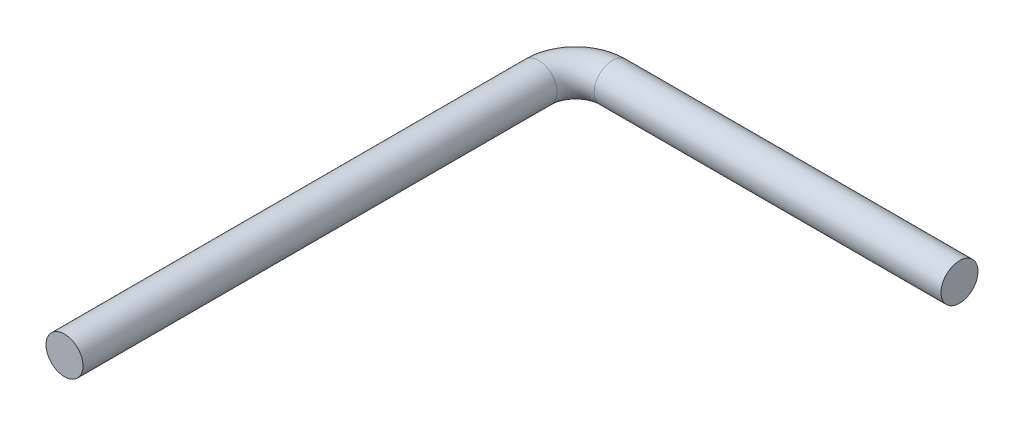
ISO-10303-21;
HEADER;
FILE_DESCRIPTION(('STEP AP214'),'2;1');
FILE_NAME('part.step','',(''),(''),'','','');
FILE_SCHEMA(('AUTOMOTIVE_DESIGN { 1 0 10303 214 1 1 1 1 }'));
ENDSEC;
DATA;
#1=APPLICATION_CONTEXT('core data for automotive mechanical design processes');
#2=APPLICATION_PROTOCOL_DEFINITION('international standard','automotive_design',2000,#1);
#3=PRODUCT_CONTEXT('',#1,'mechanical');
#4=PRODUCT('Part','Part','',(#3));
#5=PRODUCT_RELATED_PRODUCT_CATEGORY('part','',(#4));
#6=PRODUCT_DEFINITION_FORMATION('','',#4);
#7=PRODUCT_DEFINITION_CONTEXT('part definition',#1,'design');
#8=PRODUCT_DEFINITION('design','',#6,#7);
#9=PRODUCT_DEFINITION_SHAPE('','',#8);
#10=(LENGTH_UNIT() NAMED_UNIT(*) SI_UNIT(.MILLI.,.METRE.));
#11=(NAMED_UNIT(*) PLANE_ANGLE_UNIT() SI_UNIT($,.RADIAN.));
#12=(NAMED_UNIT(*) SI_UNIT($,.STERADIAN.) SOLID_ANGLE_UNIT());
#13=UNCERTAINTY_MEASURE_WITH_UNIT(LENGTH_MEASURE(1.E-05),#10,'distance_accuracy_value','');
#14=(GEOMETRIC_REPRESENTATION_CONTEXT(3) GLOBAL_UNCERTAINTY_ASSIGNED_CONTEXT((#13)) GLOBAL_UNIT_ASSIGNED_CONTEXT((#10,
#11,#12)) REPRESENTATION_CONTEXT('',''));
#15=CARTESIAN_POINT('',(0.,0.,0.));
#16=DIRECTION('',(0.,0.,1.));
#17=DIRECTION('',(1.,0.,0.));
#18=AXIS2_PLACEMENT_3D('',#15,#16,#17);
#19=CARTESIAN_POINT('',(-18.461229957774,0.,16.0876295422586));
#20=DIRECTION('',(0.,0.,-1.));
#21=DIRECTION('',(-1.,0.,0.));
#22=AXIS2_PLACEMENT_3D('',#19,#20,#21);
#23=PLANE('',#22);
#24=CARTESIAN_POINT('',(-18.461229957774,0.,16.0876295422586));
#25=DIRECTION('',(0.,0.,-1.));
#26=DIRECTION('',(-1.,0.,0.));
#27=AXIS2_PLACEMENT_3D('',#24,#25,#26);
#28=CIRCLE('',#27,1.27);
#29=CARTESIAN_POINT('',(-19.731229957774,0.,16.0876295422586));
#30=VERTEX_POINT('',#29);
#31=EDGE_CURVE('E54',#30,#30,#28,.T.);
#32=ORIENTED_EDGE('',*,*,#31,.F.);
#33=EDGE_LOOP('',(#32));
#34=FACE_BOUND('',#33,.T.);
#35=ADVANCED_FACE('F35',(#34),#23,.F.);
#36=CARTESIAN_POINT('',(7.89127004222596,0.,-18.9948504577414));
#37=DIRECTION('',(1.,0.,0.));
#38=DIRECTION('',(0.,0.,-1.));
#39=AXIS2_PLACEMENT_3D('',#36,#37,#38);
#40=PLANE('',#39);
#41=CARTESIAN_POINT('',(7.89127004222596,0.,-18.9948504577414));
#42=DIRECTION('',(1.,0.,0.));
#43=DIRECTION('',(0.,0.,-1.));
#44=AXIS2_PLACEMENT_3D('',#41,#42,#43);
#45=CIRCLE('',#44,1.27);
#46=CARTESIAN_POINT('',(7.89127004222596,0.,-20.2648504577414));
#47=VERTEX_POINT('',#46);
#48=EDGE_CURVE('E10',#47,#47,#45,.T.);
#49=ORIENTED_EDGE('',*,*,#48,.T.);
#50=EDGE_LOOP('',(#49));
#51=FACE_BOUND('',#50,.T.);
#52=ADVANCED_FACE('F65',(#51),#40,.T.);
#53=CARTESIAN_POINT('',(-18.461229957774,0.,16.0876295422586));
#54=DIRECTION('',(0.,0.,-1.));
#55=DIRECTION('',(-1.,0.,0.));
#56=AXIS2_PLACEMENT_3D('',#53,#54,#55);
#57=CYLINDRICAL_SURFACE('',#56,1.27);
#58=CARTESIAN_POINT('',(-18.461229957774,0.,-16.4548504577414));
#59=DIRECTION('',(0.,0.,-1.));
#60=DIRECTION('',(-1.,0.,0.));
#61=AXIS2_PLACEMENT_3D('',#58,#59,#60);
#62=CIRCLE('',#61,1.27);
#63=CARTESIAN_POINT('',(-19.731229957774,0.,-16.4548504577413));
#64=VERTEX_POINT('',#63);
#65=EDGE_CURVE('E48',#64,#64,#62,.T.);
#66=ORIENTED_EDGE('',*,*,#65,.F.);
#67=EDGE_LOOP('',(#66));
#68=FACE_BOUND('',#67,.T.);
#69=ORIENTED_EDGE('',*,*,#31,.T.);
#70=EDGE_LOOP('',(#69));
#71=FACE_BOUND('',#70,.T.);
#72=ADVANCED_FACE('F62',(#68,#71),#57,.T.);
#73=CARTESIAN_POINT('',(-15.921229957774,0.,-16.4548504577414));
#74=DIRECTION('',(0.,-1.,0.));
#75=DIRECTION('',(0.,0.,-1.));
#76=AXIS2_PLACEMENT_3D('',#73,#74,#75);
#77=TOROIDAL_SURFACE('',#76,2.54,1.27);
#78=CARTESIAN_POINT('',(-15.9212299577742,0.,-18.9948504577414));
#79=DIRECTION('',(1.,0.,0.));
#80=DIRECTION('',(0.,0.,-1.));
#81=AXIS2_PLACEMENT_3D('',#78,#79,#80);
#82=CIRCLE('',#81,1.27);
#83=CARTESIAN_POINT('',(-15.9212299577742,0.,-20.2648504577414));
#84=VERTEX_POINT('',#83);
#85=EDGE_CURVE('E42',#84,#84,#82,.T.);
#86=CARTESIAN_POINT('',(-15.921229957774,0.,-16.4548504577414));
#87=DIRECTION('',(0.,-1.,0.));
#88=DIRECTION('',(0.,0.,-1.));
#89=AXIS2_PLACEMENT_3D('',#86,#87,#88);
#90=CIRCLE('',#89,3.81);
#91=EDGE_CURVE('',#64,#84,#90,.T.);
#92=ORIENTED_EDGE('',*,*,#65,.T.);
#93=ORIENTED_EDGE('',*,*,#85,.F.);
#94=ORIENTED_EDGE('',*,*,#91,.T.);
#95=ORIENTED_EDGE('',*,*,#91,.F.);
#96=EDGE_LOOP('',(#92,#94,#93,#95));
#97=FACE_BOUND('',#96,.T.);
#98=ADVANCED_FACE('F71',(#97),#77,.T.);
#99=CARTESIAN_POINT('',(-15.921229957774,0.,-18.9948504577414));
#100=DIRECTION('',(1.,0.,0.));
#101=DIRECTION('',(0.,0.,-1.));
#102=AXIS2_PLACEMENT_3D('',#99,#100,#101);
#103=CYLINDRICAL_SURFACE('',#102,1.27);
#104=ORIENTED_EDGE('',*,*,#48,.F.);
#105=EDGE_LOOP('',(#104));
#106=FACE_BOUND('',#105,.T.);
#107=ORIENTED_EDGE('',*,*,#85,.T.);
#108=EDGE_LOOP('',(#107));
#109=FACE_BOUND('',#108,.T.);
#110=ADVANCED_FACE('F69',(#106,#109),#103,.T.);
#111=CLOSED_SHELL('',(#35,#52,#72,#98,#110));
#112=MANIFOLD_SOLID_BREP('B2',#111);
#113=ADVANCED_BREP_SHAPE_REPRESENTATION('',(#18,#112),#14);
#114=SHAPE_DEFINITION_REPRESENTATION(#9,#113);
ENDSEC;
END-ISO-10303-21;
